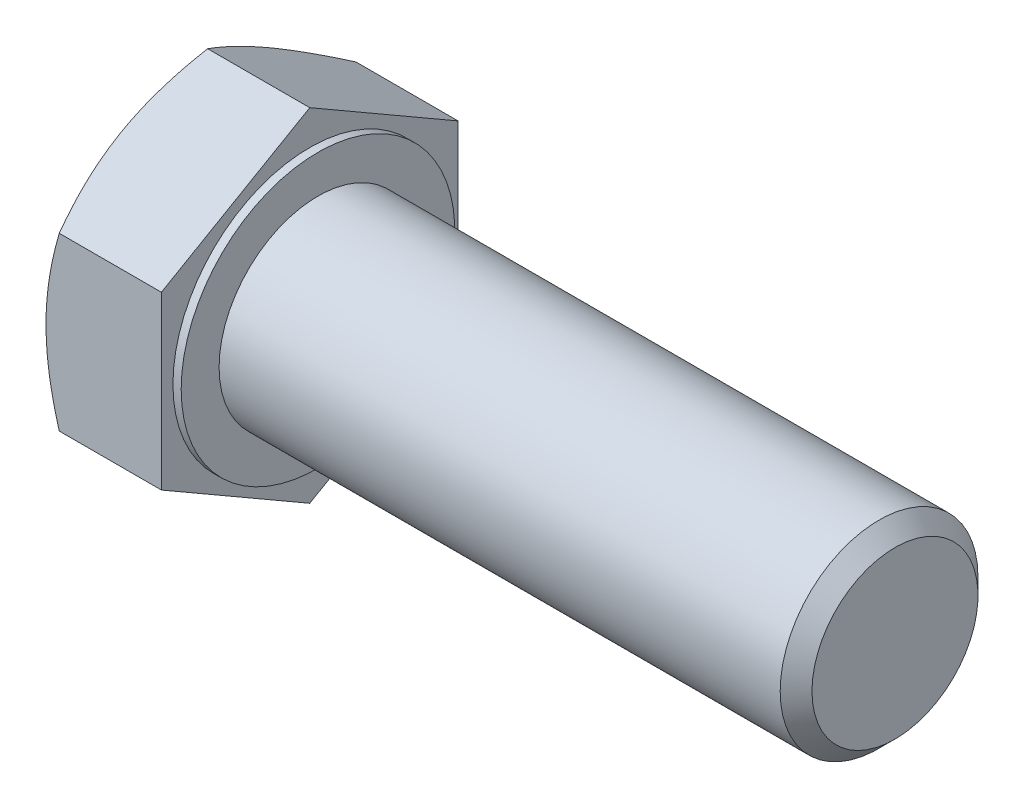
ISO-10303-21;
HEADER;
FILE_DESCRIPTION(('STEP AP214'),'2;1');
FILE_NAME('part.step','',(''),(''),'','','');
FILE_SCHEMA(('AUTOMOTIVE_DESIGN { 1 0 10303 214 1 1 1 1 }'));
ENDSEC;
DATA;
#1=APPLICATION_CONTEXT('core data for automotive mechanical design processes');
#2=APPLICATION_PROTOCOL_DEFINITION('international standard','automotive_design',2000,#1);
#3=PRODUCT_CONTEXT('',#1,'mechanical');
#4=PRODUCT('Part','Part','',(#3));
#5=PRODUCT_RELATED_PRODUCT_CATEGORY('part','',(#4));
#6=PRODUCT_DEFINITION_FORMATION('','',#4);
#7=PRODUCT_DEFINITION_CONTEXT('part definition',#1,'design');
#8=PRODUCT_DEFINITION('design','',#6,#7);
#9=PRODUCT_DEFINITION_SHAPE('','',#8);
#10=(LENGTH_UNIT() NAMED_UNIT(*) SI_UNIT(.MILLI.,.METRE.));
#11=(NAMED_UNIT(*) PLANE_ANGLE_UNIT() SI_UNIT($,.RADIAN.));
#12=(NAMED_UNIT(*) SI_UNIT($,.STERADIAN.) SOLID_ANGLE_UNIT());
#13=UNCERTAINTY_MEASURE_WITH_UNIT(LENGTH_MEASURE(1.E-05),#10,'distance_accuracy_value','');
#14=(GEOMETRIC_REPRESENTATION_CONTEXT(3) GLOBAL_UNCERTAINTY_ASSIGNED_CONTEXT((#13)) GLOBAL_UNIT_ASSIGNED_CONTEXT((#10,
#11,#12)) REPRESENTATION_CONTEXT('',''));
#15=CARTESIAN_POINT('',(0.,0.,0.));
#16=DIRECTION('',(0.,0.,1.));
#17=DIRECTION('',(1.,0.,0.));
#18=AXIS2_PLACEMENT_3D('',#15,#16,#17);
#19=CARTESIAN_POINT('',(7.5,10.3923048454133,0.));
#20=DIRECTION('',(1.,0.,0.));
#21=DIRECTION('',(0.,0.,-1.));
#22=AXIS2_PLACEMENT_3D('',#19,#20,#21);
#23=PLANE('',#22);
#24=CARTESIAN_POINT('',(7.5,0.,0.));
#25=DIRECTION('',(1.,0.,0.));
#26=DIRECTION('',(0.,0.,-1.));
#27=AXIS2_PLACEMENT_3D('',#24,#25,#26);
#28=CIRCLE('',#27,6.);
#29=CARTESIAN_POINT('',(7.5,0.,-6.));
#30=VERTEX_POINT('',#29);
#31=EDGE_CURVE('E150',#30,#30,#28,.F.);
#32=ORIENTED_EDGE('',*,*,#31,.T.);
#33=EDGE_LOOP('',(#32));
#34=FACE_BOUND('',#33,.T.);
#35=CARTESIAN_POINT('',(7.5,0.,0.));
#36=DIRECTION('',(-1.,0.,0.));
#37=DIRECTION('',(0.,0.,1.));
#38=AXIS2_PLACEMENT_3D('',#35,#36,#37);
#39=CIRCLE('',#38,8.3);
#40=CARTESIAN_POINT('',(7.5,0.,8.3));
#41=VERTEX_POINT('',#40);
#42=EDGE_CURVE('E341',#41,#41,#39,.T.);
#43=ORIENTED_EDGE('',*,*,#42,.F.);
#44=EDGE_LOOP('',(#43));
#45=FACE_BOUND('',#44,.T.);
#46=ADVANCED_FACE('F55',(#34,#45),#23,.T.);
#47=CARTESIAN_POINT('',(0.,0.,0.));
#48=DIRECTION('',(-1.,0.,0.));
#49=DIRECTION('',(0.,0.,1.));
#50=AXIS2_PLACEMENT_3D('',#47,#48,#49);
#51=CYLINDRICAL_SURFACE('',#50,6.);
#52=ORIENTED_EDGE('',*,*,#31,.F.);
#53=EDGE_LOOP('',(#52));
#54=FACE_BOUND('',#53,.T.);
#55=CARTESIAN_POINT('',(41.536,0.,0.));
#56=DIRECTION('',(-1.,0.,0.));
#57=DIRECTION('',(0.,0.,1.));
#58=AXIS2_PLACEMENT_3D('',#55,#56,#57);
#59=CIRCLE('',#58,6.);
#60=CARTESIAN_POINT('',(41.536,0.,6.));
#61=VERTEX_POINT('',#60);
#62=EDGE_CURVE('E159',#61,#61,#59,.T.);
#63=ORIENTED_EDGE('',*,*,#62,.T.);
#64=EDGE_LOOP('',(#63));
#65=FACE_BOUND('',#64,.T.);
#66=ADVANCED_FACE('F313',(#54,#65),#51,.T.);
#67=CARTESIAN_POINT('',(42.5,0.,0.));
#68=DIRECTION('',(-1.,0.,0.));
#69=DIRECTION('',(0.,0.,1.));
#70=AXIS2_PLACEMENT_3D('',#67,#68,#69);
#71=CONICAL_SURFACE('',#70,5.036,0.785398163397442);
#72=ORIENTED_EDGE('',*,*,#62,.F.);
#73=EDGE_LOOP('',(#72));
#74=FACE_BOUND('',#73,.T.);
#75=CARTESIAN_POINT('',(42.5,0.,0.));
#76=DIRECTION('',(-1.,0.,0.));
#77=DIRECTION('',(0.,0.,1.));
#78=AXIS2_PLACEMENT_3D('',#75,#76,#77);
#79=CIRCLE('',#78,5.036);
#80=CARTESIAN_POINT('',(42.5,0.,5.036));
#81=VERTEX_POINT('',#80);
#82=EDGE_CURVE('E304',#81,#81,#79,.T.);
#83=ORIENTED_EDGE('',*,*,#82,.T.);
#84=EDGE_LOOP('',(#83));
#85=FACE_BOUND('',#84,.T.);
#86=ADVANCED_FACE('F315',(#74,#85),#71,.T.);
#87=CARTESIAN_POINT('',(42.5,0.,0.));
#88=DIRECTION('',(-1.,0.,0.));
#89=DIRECTION('',(0.,0.,1.));
#90=AXIS2_PLACEMENT_3D('',#87,#88,#89);
#91=PLANE('',#90);
#92=ORIENTED_EDGE('',*,*,#82,.F.);
#93=EDGE_LOOP('',(#92));
#94=FACE_BOUND('',#93,.T.);
#95=ADVANCED_FACE('F318',(#94),#91,.F.);
#96=CARTESIAN_POINT('',(7.,8.3,0.));
#97=DIRECTION('',(1.,0.,0.));
#98=DIRECTION('',(0.,0.,-1.));
#99=AXIS2_PLACEMENT_3D('',#96,#97,#98);
#100=PLANE('',#99);
#101=CARTESIAN_POINT('',(7.,0.,0.));
#102=DIRECTION('',(-1.,0.,0.));
#103=DIRECTION('',(0.,0.,1.));
#104=AXIS2_PLACEMENT_3D('',#101,#102,#103);
#105=CIRCLE('',#104,8.3);
#106=CARTESIAN_POINT('',(7.,0.,8.3));
#107=VERTEX_POINT('',#106);
#108=EDGE_CURVE('E344',#107,#107,#105,.T.);
#109=ORIENTED_EDGE('',*,*,#108,.T.);
#110=EDGE_LOOP('',(#109));
#111=FACE_BOUND('',#110,.T.);
#112=DIRECTION('',(0.,0.500000000000001,0.866025403784438));
#113=VECTOR('',#112,1.);
#114=CARTESIAN_POINT('',(7.,5.19615242270662,-9.));
#115=LINE('',#114,#113);
#116=CARTESIAN_POINT('',(7.,5.19615242270662,-9.));
#117=VERTEX_POINT('',#116);
#118=CARTESIAN_POINT('',(7.,10.3923048454133,0.));
#119=VERTEX_POINT('',#118);
#120=EDGE_CURVE('E128',#117,#119,#115,.T.);
#121=ORIENTED_EDGE('',*,*,#120,.T.);
#122=DIRECTION('',(0.,-0.500000000000001,0.866025403784438));
#123=VECTOR('',#122,1.);
#124=CARTESIAN_POINT('',(7.,10.3923048454133,0.));
#125=LINE('',#124,#123);
#126=CARTESIAN_POINT('',(7.,5.19615242270662,9.));
#127=VERTEX_POINT('',#126);
#128=EDGE_CURVE('E141',#119,#127,#125,.T.);
#129=ORIENTED_EDGE('',*,*,#128,.T.);
#130=DIRECTION('',(0.,-1.,0.));
#131=VECTOR('',#130,1.);
#132=CARTESIAN_POINT('',(7.,5.19615242270662,9.));
#133=LINE('',#132,#131);
#134=CARTESIAN_POINT('',(7.,-5.19615242270661,9.));
#135=VERTEX_POINT('',#134);
#136=EDGE_CURVE('E357',#127,#135,#133,.T.);
#137=ORIENTED_EDGE('',*,*,#136,.T.);
#138=DIRECTION('',(0.,-0.500000000000002,-0.866025403784438));
#139=VECTOR('',#138,1.);
#140=CARTESIAN_POINT('',(7.,-10.3923048454133,0.));
#141=LINE('',#140,#139);
#142=CARTESIAN_POINT('',(7.,-10.3923048454133,0.));
#143=VERTEX_POINT('',#142);
#144=EDGE_CURVE('E354',#135,#143,#141,.T.);
#145=ORIENTED_EDGE('',*,*,#144,.T.);
#146=DIRECTION('',(0.,0.5,-0.866025403784439));
#147=VECTOR('',#146,1.);
#148=CARTESIAN_POINT('',(7.,-5.19615242270664,-9.));
#149=LINE('',#148,#147);
#150=CARTESIAN_POINT('',(7.,-5.19615242270664,-9.));
#151=VERTEX_POINT('',#150);
#152=EDGE_CURVE('E71',#143,#151,#149,.T.);
#153=ORIENTED_EDGE('',*,*,#152,.T.);
#154=DIRECTION('',(0.,1.,0.));
#155=VECTOR('',#154,1.);
#156=CARTESIAN_POINT('',(7.,5.19615242270662,-9.));
#157=LINE('',#156,#155);
#158=EDGE_CURVE('E11',#151,#117,#157,.T.);
#159=ORIENTED_EDGE('',*,*,#158,.T.);
#160=EDGE_LOOP('',(#121,#129,#137,#145,#153,#159));
#161=FACE_BOUND('',#160,.T.);
#162=ADVANCED_FACE('F127',(#111,#161),#100,.T.);
#163=CARTESIAN_POINT('',(0.,0.,0.));
#164=DIRECTION('',(-1.,0.,0.));
#165=DIRECTION('',(0.,0.,1.));
#166=AXIS2_PLACEMENT_3D('',#163,#164,#165);
#167=CYLINDRICAL_SURFACE('',#166,8.3);
#168=ORIENTED_EDGE('',*,*,#42,.T.);
#169=EDGE_LOOP('',(#168));
#170=FACE_BOUND('',#169,.T.);
#171=ORIENTED_EDGE('',*,*,#108,.F.);
#172=EDGE_LOOP('',(#171));
#173=FACE_BOUND('',#172,.T.);
#174=ADVANCED_FACE('F327',(#170,#173),#167,.T.);
#175=CARTESIAN_POINT('',(0.,10.3923048454133,0.));
#176=DIRECTION('',(1.,0.,0.));
#177=DIRECTION('',(0.,0.,-1.));
#178=AXIS2_PLACEMENT_3D('',#175,#176,#177);
#179=PLANE('',#178);
#180=CARTESIAN_POINT('',(0.,0.,0.));
#181=DIRECTION('',(1.,0.,0.));
#182=DIRECTION('',(0.,0.,-1.));
#183=AXIS2_PLACEMENT_3D('',#180,#181,#182);
#184=CIRCLE('',#183,9.);
#185=CARTESIAN_POINT('',(0.,0.,-9.));
#186=VERTEX_POINT('',#185);
#187=CARTESIAN_POINT('',(0.,7.79422863405994,-4.50000000000001));
#188=VERTEX_POINT('',#187);
#189=EDGE_CURVE('E65',#186,#188,#184,.T.);
#190=ORIENTED_EDGE('',*,*,#189,.F.);
#191=CARTESIAN_POINT('',(0.,-7.79422863405995,-4.5));
#192=VERTEX_POINT('',#191);
#193=EDGE_CURVE('E172',#192,#186,#184,.T.);
#194=ORIENTED_EDGE('',*,*,#193,.F.);
#195=CARTESIAN_POINT('',(0.,-7.79422863405994,4.50000000000002));
#196=VERTEX_POINT('',#195);
#197=EDGE_CURVE('E175',#196,#192,#184,.T.);
#198=ORIENTED_EDGE('',*,*,#197,.F.);
#199=CARTESIAN_POINT('',(0.,0.,9.));
#200=VERTEX_POINT('',#199);
#201=EDGE_CURVE('E183',#200,#196,#184,.T.);
#202=ORIENTED_EDGE('',*,*,#201,.F.);
#203=CARTESIAN_POINT('',(0.,0.,0.));
#204=DIRECTION('',(-1.,0.,0.));
#205=DIRECTION('',(0.,0.,1.));
#206=AXIS2_PLACEMENT_3D('',#203,#204,#205);
#207=CIRCLE('',#206,9.);
#208=CARTESIAN_POINT('',(0.,7.79422863405994,4.50000000000001));
#209=VERTEX_POINT('',#208);
#210=EDGE_CURVE('E140',#200,#209,#207,.T.);
#211=ORIENTED_EDGE('',*,*,#210,.T.);
#212=EDGE_CURVE('E185',#188,#209,#184,.T.);
#213=ORIENTED_EDGE('',*,*,#212,.F.);
#214=EDGE_LOOP('',(#190,#194,#198,#202,#211,#213));
#215=FACE_BOUND('',#214,.T.);
#216=ADVANCED_FACE('F210',(#215),#179,.F.);
#217=CARTESIAN_POINT('',(0.,0.,0.));
#218=DIRECTION('',(1.,0.,0.));
#219=DIRECTION('',(0.,0.,-1.));
#220=AXIS2_PLACEMENT_3D('',#217,#218,#219);
#221=CONICAL_SURFACE('',#220,9.,1.0471975511966);
#222=CARTESIAN_POINT('',(0.803914245071126,5.19603695265279,9.0002));
#223=CARTESIAN_POINT('',(0.737982001874049,5.31024090414013,8.80239295359879));
#224=CARTESIAN_POINT('',(0.675041409210307,5.42489028935502,8.60381439335006));
#225=CARTESIAN_POINT('',(0.555968997655531,5.65512011728599,8.20504463395579));
#226=CARTESIAN_POINT('',(0.499840117752057,5.77070093910681,8.00485277818155));
#227=CARTESIAN_POINT('',(0.395151960728957,6.00300811711761,7.6024849429039));
#228=CARTESIAN_POINT('',(0.346610772912781,6.11973652630803,7.4003054074994));
#229=CARTESIAN_POINT('',(0.258148516787916,6.35398725476076,6.99457124410926));
#230=CARTESIAN_POINT('',(0.21822568748327,6.47150940676615,6.79101690582109));
#231=CARTESIAN_POINT('',(0.148684674147111,6.70436794207327,6.38769409169309));
#232=CARTESIAN_POINT('',(0.118837502847797,6.81968712510142,6.187955407601));
#233=CARTESIAN_POINT('',(0.0687933098590788,7.05084147798785,5.78758432401101));
#234=CARTESIAN_POINT('',(0.0485954355375368,7.16667660134328,5.5869520050584));
#235=CARTESIAN_POINT('',(0.0183543473973442,7.39854776775318,5.18533936402619));
#236=CARTESIAN_POINT('',(0.00829960958430043,7.51458343241836,4.98435969733607));
#237=CARTESIAN_POINT('',(-0.00143766485492008,7.74676155069016,4.58221540008358));
#238=CARTESIAN_POINT('',(-0.00112052193524597,7.86290400088661,4.38105077542778));
#239=CARTESIAN_POINT('',(0.00916395215317157,8.08003584616207,4.0049673874695));
#240=CARTESIAN_POINT('',(0.0178767400303957,8.18104055171996,3.83002210563971));
#241=CARTESIAN_POINT('',(0.042977340065369,8.38281337570172,3.48054132291666));
#242=CARTESIAN_POINT('',(0.0593656695806686,8.4835814777175,3.30600585044303));
#243=CARTESIAN_POINT('',(0.119656556235829,8.7854956741391,2.7830751227145));
#244=CARTESIAN_POINT('',(0.174677482341129,8.98610736306936,2.43560548489509));
#245=CARTESIAN_POINT('',(0.312230476325152,9.38945876049729,1.736980371246));
#246=CARTESIAN_POINT('',(0.395345618627108,9.59214699192737,1.38591405631283));
#247=CARTESIAN_POINT('',(0.583982539436463,9.99450087051226,0.689016695981395));
#248=CARTESIAN_POINT('',(0.689460012893358,10.1941716700214,0.343176726443721));
#249=CARTESIAN_POINT('',(0.803914245071132,10.3924203154671,-0.000199999999999286));
#250=B_SPLINE_CURVE_WITH_KNOTS('',3,(#222,#223,#224,#225,#226,#227,#228,#229,#230,#231,#232,
#233,#234,#235,#236,#237,#238,#239,#240,#241,#242,#243,#244,#245,#246,#247,#248,#249),
.UNSPECIFIED.,.F.,.F.,(4,2,2,2,2,2,2,2,2,2,2,2,2,4),(0.,0.713219249102575,1.42674513853509,
2.14194697262263,2.8570025303448,3.55449749123034,4.25193080859215,4.94857085059645,
5.64518936892662,6.25162976378284,6.85811104066341,8.07193747617894,9.31268391793542,
10.5509947443908),.UNSPECIFIED.);
#251=CARTESIAN_POINT('',(0.803847577293367,10.3923048454133,0.));
#252=VERTEX_POINT('',#251);
#253=EDGE_CURVE('E231',#209,#252,#250,.T.);
#254=ORIENTED_EDGE('',*,*,#253,.T.);
#255=CARTESIAN_POINT('',(0.803914245071133,10.3924203154671,0.0002));
#256=CARTESIAN_POINT('',(0.737982001874055,10.2782163639798,-0.197607046401216));
#257=CARTESIAN_POINT('',(0.675041409210313,10.1635669787649,-0.396185606649945));
#258=CARTESIAN_POINT('',(0.555968997655536,9.93333715083391,-0.794955366044209));
#259=CARTESIAN_POINT('',(0.499840117752062,9.81775632901308,-0.99514722181845));
#260=CARTESIAN_POINT('',(0.395151960728962,9.58544915100228,-1.3975150570961));
#261=CARTESIAN_POINT('',(0.346610772912787,9.46872074181186,-1.5996945925006));
#262=CARTESIAN_POINT('',(0.258148516787921,9.23447001335913,-2.00542875589074));
#263=CARTESIAN_POINT('',(0.218225687483273,9.11694786135374,-2.20898309417891));
#264=CARTESIAN_POINT('',(0.148684674147113,8.88408932604662,-2.61230590830691));
#265=CARTESIAN_POINT('',(0.118837502847799,8.76877014301847,-2.812044592399));
#266=CARTESIAN_POINT('',(0.0687933098590814,8.53761579013205,-3.21241567598899));
#267=CARTESIAN_POINT('',(0.0485954355375386,8.42178066677662,-3.4130479949416));
#268=CARTESIAN_POINT('',(0.0183543473973454,8.18990950036671,-3.81466063597382));
#269=CARTESIAN_POINT('',(0.00829960958430177,8.07387383570153,-4.01564030266393));
#270=CARTESIAN_POINT('',(-0.00143766485491891,7.84169571742973,-4.41778459991642));
#271=CARTESIAN_POINT('',(-0.00112052193524512,7.72555326723328,-4.61894922457222));
#272=CARTESIAN_POINT('',(0.00916395215317128,7.50842142195782,-4.9950326125305));
#273=CARTESIAN_POINT('',(0.0178767400303946,7.40741671639993,-5.16997789436029));
#274=CARTESIAN_POINT('',(0.0429773400653671,7.20564389241818,-5.51945867708335));
#275=CARTESIAN_POINT('',(0.0593656695806669,7.10487579040239,-5.69399414955697));
#276=CARTESIAN_POINT('',(0.119656556235828,6.80296159398079,-6.2169248772855));
#277=CARTESIAN_POINT('',(0.174677482341126,6.60234990505054,-6.56439451510491));
#278=CARTESIAN_POINT('',(0.312230476325148,6.1989985076226,-7.263019628754));
#279=CARTESIAN_POINT('',(0.395345618627104,5.99631027619252,-7.61408594368717));
#280=CARTESIAN_POINT('',(0.583982539436458,5.59395639760763,-8.3109833040186));
#281=CARTESIAN_POINT('',(0.689460012893353,5.39428559809852,-8.65682327355628));
#282=CARTESIAN_POINT('',(0.803914245071127,5.19603695265279,-9.0002));
#283=B_SPLINE_CURVE_WITH_KNOTS('',3,(#255,#256,#257,#258,#259,#260,#261,#262,#263,#264,#265,
#266,#267,#268,#269,#270,#271,#272,#273,#274,#275,#276,#277,#278,#279,#280,#281,#282),
.UNSPECIFIED.,.F.,.F.,(4,2,2,2,2,2,2,2,2,2,2,2,2,4),(0.,0.713219249102579,1.42674513853509,
2.14194697262263,2.8570025303448,3.55449749123034,4.25193080859215,4.94857085059645,
5.64518936892663,6.25162976378284,6.85811104066341,8.07193747617895,9.31268391793542,
10.5509947443908),.UNSPECIFIED.);
#284=EDGE_CURVE('E79',#252,#188,#283,.T.);
#285=ORIENTED_EDGE('',*,*,#284,.T.);
#286=ORIENTED_EDGE('',*,*,#212,.T.);
#287=EDGE_LOOP('',(#254,#285,#286));
#288=FACE_BOUND('',#287,.T.);
#289=ADVANCED_FACE('F407',(#288),#221,.T.);
#290=CARTESIAN_POINT('',(4.50308345116275,-14.1853984650015,9.));
#291=CARTESIAN_POINT('',(4.31054430443782,-13.7903499522351,9.));
#292=CARTESIAN_POINT('',(4.11978647586971,-13.3944187196266,9.));
#293=CARTESIAN_POINT('',(3.74283090620236,-12.6003222266754,9.));
#294=CARTESIAN_POINT('',(3.55663384146592,-12.2021566456113,9.));
#295=CARTESIAN_POINT('',(3.18890856344588,-11.4011783965729,9.));
#296=CARTESIAN_POINT('',(3.00740939067649,-10.9983523517115,9.));
#297=CARTESIAN_POINT('',(2.65153988681447,-10.1895752665153,9.));
#298=CARTESIAN_POINT('',(2.47716923358452,-9.78362436837962,9.));
#299=CARTESIAN_POINT('',(2.1316124492693,-8.953981891894,9.));
#300=CARTESIAN_POINT('',(1.96074001408348,-8.53015895315932,9.));
#301=CARTESIAN_POINT('',(1.63138410023259,-7.6776404040306,9.));
#302=CARTESIAN_POINT('',(1.47290197976961,-7.24894426532903,9.));
#303=CARTESIAN_POINT('',(1.17232155137939,-6.38672363138014,9.));
#304=CARTESIAN_POINT('',(1.0301919447447,-5.95321016213059,9.));
#305=CARTESIAN_POINT('',(0.766724668389701,-5.07998336095625,9.));
#306=CARTESIAN_POINT('',(0.645380685452063,-4.64027195560254,9.));
#307=CARTESIAN_POINT('',(0.429822600041207,-3.75682505769697,9.));
#308=CARTESIAN_POINT('',(0.335452586446509,-3.31312863828557,9.));
#309=CARTESIAN_POINT('',(0.218090109997791,-2.6433671330566,9.));
#310=CARTESIAN_POINT('',(0.1829998621584,-2.41939560703653,9.));
#311=CARTESIAN_POINT('',(0.121565667357827,-1.9702635438669,9.));
#312=CARTESIAN_POINT('',(0.0952208701204425,-1.74510312447118,9.));
#313=CARTESIAN_POINT('',(0.0521451472278595,-1.29693480879161,9.));
#314=CARTESIAN_POINT('',(0.0352889798642664,-1.07393900194961,9.));
#315=CARTESIAN_POINT('',(0.0110310639342778,-0.627433600763141,9.));
#316=CARTESIAN_POINT('',(0.00362915208926377,-0.40392401535862,9.));
#317=CARTESIAN_POINT('',(-0.00154262379217504,0.0432079361744999,9.));
#318=CARTESIAN_POINT('',(0.000687480645623833,0.266830301931571,9.));
#319=CARTESIAN_POINT('',(0.01472260772345,0.713776872824072,9.));
#320=CARTESIAN_POINT('',(0.0265280659473003,0.93710106393258,9.));
#321=CARTESIAN_POINT('',(0.0656502898571858,1.46707211896635,9.));
#322=CARTESIAN_POINT('',(0.0971347677291201,1.77341845056802,9.));
#323=CARTESIAN_POINT('',(0.176454333238005,2.38397028008967,9.));
#324=CARTESIAN_POINT('',(0.224291457717823,2.6881755064995,9.));
#325=CARTESIAN_POINT('',(0.389806402965327,3.59715813116676,9.));
#326=CARTESIAN_POINT('',(0.529461896846416,4.19799412652232,9.));
#327=CARTESIAN_POINT('',(0.773331871848972,5.09670706348811,9.));
#328=CARTESIAN_POINT('',(0.861532431142633,5.39919910543196,9.));
#329=CARTESIAN_POINT('',(1.04752099203163,6.00125026101996,9.));
#330=CARTESIAN_POINT('',(1.14530906206943,6.30080935370985,9.));
#331=CARTESIAN_POINT('',(1.34886866039496,6.89708058771342,9.));
#332=CARTESIAN_POINT('',(1.45463787690012,7.19379352557788,9.));
#333=CARTESIAN_POINT('',(1.6728730196874,7.78473287386445,9.));
#334=CARTESIAN_POINT('',(1.78533883473293,8.07895932549671,9.));
#335=CARTESIAN_POINT('',(2.07523735271454,8.8161944490185,9.));
#336=CARTESIAN_POINT('',(2.25629467011385,9.25777584408896,9.));
#337=CARTESIAN_POINT('',(2.62827522263087,10.1367776511578,9.));
#338=CARTESIAN_POINT('',(2.81919928705198,10.5741977097237,9.));
#339=CARTESIAN_POINT('',(3.20877963371492,11.4457286497122,9.));
#340=CARTESIAN_POINT('',(3.40743823107647,11.8798384930871,9.));
#341=CARTESIAN_POINT('',(3.81079737205718,12.7452179469075,9.));
#342=CARTESIAN_POINT('',(4.01549773502308,13.1764876418049,9.));
#343=CARTESIAN_POINT('',(4.43000777500988,14.0372827141758,9.));
#344=CARTESIAN_POINT('',(4.63982402220295,14.466804921625,9.));
#345=CARTESIAN_POINT('',(5.06336871339291,15.3239162694583,9.));
#346=CARTESIAN_POINT('',(5.27709718099328,15.7515053981603,9.));
#347=CARTESIAN_POINT('',(5.70771289609102,16.6049951424422,9.));
#348=CARTESIAN_POINT('',(5.92459958876705,17.0308960382694,9.));
#349=CARTESIAN_POINT('',(6.36101693257489,17.8813418239716,9.));
#350=CARTESIAN_POINT('',(6.58054759472945,18.305886708184,9.));
#351=CARTESIAN_POINT('',(7.20096689356042,19.4981240117253,9.));
#352=CARTESIAN_POINT('',(7.60436223424865,20.2645118375987,9.));
#353=CARTESIAN_POINT('',(8.41646747703505,21.7945065925678,9.));
#354=CARTESIAN_POINT('',(8.82517763220601,22.558113387008,9.));
#355=CARTESIAN_POINT('',(9.6453899211846,24.08088542414,9.));
#356=CARTESIAN_POINT('',(10.0568800806834,24.8400571209878,9.));
#357=CARTESIAN_POINT('',(10.6764233675492,25.9775231898088,9.));
#358=CARTESIAN_POINT('',(10.8833155902988,26.3564507889065,9.));
#359=CARTESIAN_POINT('',(11.2977907102886,27.1139273756374,9.));
#360=CARTESIAN_POINT('',(11.5053736065156,27.4924763638249,9.));
#361=CARTESIAN_POINT('',(11.7132605802833,27.8708583347744,9.));
#362=B_SPLINE_CURVE_WITH_KNOTS('',3,(#290,#291,#292,#293,#294,#295,#296,#297,#298,#299,#300,
#301,#302,#303,#304,#305,#306,#307,#308,#309,#310,#311,#312,#313,#314,#315,#316,#317,#318,#319,
#320,#321,#322,#323,#324,#325,#326,#327,#328,#329,#330,#331,#332,#333,#334,#335,#336,#337,#338,
#339,#340,#341,#342,#343,#344,#345,#346,#347,#348,#349,#350,#351,#352,#353,#354,#355,#356,#357,
#358,#359,#360,#361),.UNSPECIFIED.,.F.,.F.,(4,2,2,2,2,2,2,2,2,2,2,2,2,2,2,2,2,2,2,2,2,2,2,2,2,2,
2,2,2,2,2,2,2,2,2,4),(0.,1.31842765114837,2.6370496560634,3.96247407620814,5.28783853415268,
6.65860358746619,8.02951869129602,9.39776460603692,10.7655942037287,12.1253499441535,
12.8053173169584,13.4852185605779,14.1559216013657,14.8266130586982,15.4973023208461,
16.1680220944284,17.0913849082023,18.0148627755644,19.862742604473,20.8079230410616,
21.75311022551,22.6980246745778,23.6429234321322,25.0745302305723,26.5062575523684,
27.9384167676661,29.3705332036396,30.8045973553514,32.2386701620091,33.6724940065179,
35.1063238307243,37.7045032490066,40.3028068397952,42.8933552129342,44.1885437295509,
45.4837303472313),.UNSPECIFIED.);
#363=CARTESIAN_POINT('',(0.803847577293361,5.19615242270662,9.));
#364=VERTEX_POINT('',#363);
#365=EDGE_CURVE('E222',#200,#364,#362,.T.);
#366=ORIENTED_EDGE('',*,*,#365,.T.);
#367=EDGE_CURVE('E223',#364,#209,#250,.T.);
#368=ORIENTED_EDGE('',*,*,#367,.T.);
#369=ORIENTED_EDGE('',*,*,#210,.F.);
#370=EDGE_LOOP('',(#366,#368,#369));
#371=FACE_BOUND('',#370,.T.);
#372=ADVANCED_FACE('F369',(#371),#221,.T.);
#373=CARTESIAN_POINT('',(0.803847577293355,-5.19615242270661,9.));
#374=VERTEX_POINT('',#373);
#375=EDGE_CURVE('E206',#374,#200,#362,.T.);
#376=ORIENTED_EDGE('',*,*,#375,.T.);
#377=ORIENTED_EDGE('',*,*,#201,.T.);
#378=CARTESIAN_POINT('',(0.803914245071129,-10.3924203154671,-0.000200000000000038));
#379=CARTESIAN_POINT('',(0.73798200187405,-10.2782163639798,0.197607046401216));
#380=CARTESIAN_POINT('',(0.675041409210308,-10.1635669787649,0.396185606649944));
#381=CARTESIAN_POINT('',(0.555968997655532,-9.9333371508339,0.794955366044208));
#382=CARTESIAN_POINT('',(0.499840117752058,-9.81775632901307,0.995147221818449));
#383=CARTESIAN_POINT('',(0.395151960728958,-9.58544915100227,1.3975150570961));
#384=CARTESIAN_POINT('',(0.346610772912781,-9.46872074181185,1.59969459250059));
#385=CARTESIAN_POINT('',(0.258148516787915,-9.23447001335912,2.00542875589074));
#386=CARTESIAN_POINT('',(0.218225687483268,-9.11694786135373,2.20898309417891));
#387=CARTESIAN_POINT('',(0.148684674147108,-8.88408932604661,2.61230590830691));
#388=CARTESIAN_POINT('',(0.118837502847793,-8.76877014301846,2.812044592399));
#389=CARTESIAN_POINT('',(0.0687933098590751,-8.53761579013204,3.21241567598899));
#390=CARTESIAN_POINT('',(0.0485954355375334,-8.42178066677661,3.4130479949416));
#391=CARTESIAN_POINT('',(0.0183543473973407,-8.1899095003667,3.81466063597381));
#392=CARTESIAN_POINT('',(0.00829960958429661,-8.07387383570152,4.01564030266393));
#393=CARTESIAN_POINT('',(-0.00143766485492478,-7.84169571742972,4.41778459991642));
#394=CARTESIAN_POINT('',(-0.00112052193525114,-7.72555326723327,4.61894922457221));
#395=CARTESIAN_POINT('',(0.00916395215316483,-7.50842142195781,4.99503261253049));
#396=CARTESIAN_POINT('',(0.017876740030388,-7.40741671639992,5.16997789436028));
#397=CARTESIAN_POINT('',(0.0429773400653602,-7.20564389241816,5.51945867708334));
#398=CARTESIAN_POINT('',(0.0593656695806599,-7.10487579040238,5.69399414955696));
#399=CARTESIAN_POINT('',(0.11965655623582,-6.80296159398078,6.2169248772855));
#400=CARTESIAN_POINT('',(0.174677482341119,-6.60234990505052,6.56439451510491));
#401=CARTESIAN_POINT('',(0.312230476325142,-6.19899850762259,7.263019628754));
#402=CARTESIAN_POINT('',(0.395345618627098,-5.99631027619251,7.61408594368717));
#403=CARTESIAN_POINT('',(0.583982539436453,-5.59395639760761,8.3109833040186));
#404=CARTESIAN_POINT('',(0.689460012893348,-5.3942855980985,8.65682327355628));
#405=CARTESIAN_POINT('',(0.803914245071121,-5.19603695265277,9.0002));
#406=B_SPLINE_CURVE_WITH_KNOTS('',3,(#378,#379,#380,#381,#382,#383,#384,#385,#386,#387,#388,
#389,#390,#391,#392,#393,#394,#395,#396,#397,#398,#399,#400,#401,#402,#403,#404,#405),
.UNSPECIFIED.,.F.,.F.,(4,2,2,2,2,2,2,2,2,2,2,2,2,4),(0.,0.713219249102579,1.42674513853509,
2.14194697262263,2.8570025303448,3.55449749123034,4.25193080859215,4.94857085059645,
5.64518936892663,6.25162976378284,6.85811104066341,8.07193747617895,9.31268391793542,
10.5509947443908),.UNSPECIFIED.);
#407=EDGE_CURVE('E204',#196,#374,#406,.T.);
#408=ORIENTED_EDGE('',*,*,#407,.T.);
#409=EDGE_LOOP('',(#376,#377,#408));
#410=FACE_BOUND('',#409,.T.);
#411=ADVANCED_FACE('F202',(#410),#221,.T.);
#412=CARTESIAN_POINT('',(0.803847577293364,-10.3923048454133,0.));
#413=VERTEX_POINT('',#412);
#414=EDGE_CURVE('E219',#413,#196,#406,.T.);
#415=ORIENTED_EDGE('',*,*,#414,.T.);
#416=ORIENTED_EDGE('',*,*,#197,.T.);
#417=CARTESIAN_POINT('',(0.803914245071132,-5.1960369526528,-9.0002));
#418=CARTESIAN_POINT('',(0.737982001874053,-5.31024090414015,-8.80239295359879));
#419=CARTESIAN_POINT('',(0.675041409210311,-5.42489028935504,-8.60381439335006));
#420=CARTESIAN_POINT('',(0.555968997655536,-5.655120117286,-8.20504463395579));
#421=CARTESIAN_POINT('',(0.499840117752062,-5.77070093910683,-8.00485277818155));
#422=CARTESIAN_POINT('',(0.395151960728962,-6.00300811711762,-7.6024849429039));
#423=CARTESIAN_POINT('',(0.346610772912786,-6.11973652630805,-7.4003054074994));
#424=CARTESIAN_POINT('',(0.25814851678792,-6.35398725476078,-6.99457124410925));
#425=CARTESIAN_POINT('',(0.218225687483273,-6.47150940676616,-6.79101690582109));
#426=CARTESIAN_POINT('',(0.148684674147114,-6.70436794207328,-6.38769409169308));
#427=CARTESIAN_POINT('',(0.1188375028478,-6.81968712510143,-6.187955407601));
#428=CARTESIAN_POINT('',(0.0687933098590818,-7.05084147798786,-5.787584324011));
#429=CARTESIAN_POINT('',(0.0485954355375398,-7.16667660134328,-5.58695200505839));
#430=CARTESIAN_POINT('',(0.0183543473973475,-7.39854776775319,-5.18533936402618));
#431=CARTESIAN_POINT('',(0.00829960958430413,-7.51458343241837,-4.98435969733606));
#432=CARTESIAN_POINT('',(-0.00143766485491676,-7.74676155069017,-4.58221540008357));
#433=CARTESIAN_POINT('',(-0.00112052193524346,-7.86290400088662,-4.38105077542778));
#434=CARTESIAN_POINT('',(0.00916395215317359,-8.08003584616208,-4.0049673874695));
#435=CARTESIAN_POINT('',(0.0178767400303979,-8.18104055171996,-3.83002210563971));
#436=CARTESIAN_POINT('',(0.0429773400653708,-8.38281337570172,-3.48054132291665));
#437=CARTESIAN_POINT('',(0.0593656695806701,-8.48358147771751,-3.30600585044303));
#438=CARTESIAN_POINT('',(0.11965655623583,-8.7854956741391,-2.7830751227145));
#439=CARTESIAN_POINT('',(0.174677482341129,-8.98610736306936,-2.43560548489509));
#440=CARTESIAN_POINT('',(0.312230476325151,-9.38945876049729,-1.736980371246));
#441=CARTESIAN_POINT('',(0.395345618627106,-9.59214699192737,-1.38591405631283));
#442=CARTESIAN_POINT('',(0.583982539436459,-9.99450087051226,-0.689016695981396));
#443=CARTESIAN_POINT('',(0.689460012893354,-10.1941716700214,-0.343176726443723));
#444=CARTESIAN_POINT('',(0.803914245071129,-10.3924203154671,0.000199999999998914));
#445=B_SPLINE_CURVE_WITH_KNOTS('',3,(#417,#418,#419,#420,#421,#422,#423,#424,#425,#426,#427,
#428,#429,#430,#431,#432,#433,#434,#435,#436,#437,#438,#439,#440,#441,#442,#443,#444),
.UNSPECIFIED.,.F.,.F.,(4,2,2,2,2,2,2,2,2,2,2,2,2,4),(0.,0.713219249102577,1.42674513853509,
2.14194697262263,2.85700253034481,3.55449749123034,4.25193080859215,4.94857085059645,
5.64518936892663,6.25162976378284,6.85811104066341,8.07193747617894,9.31268391793541,
10.5509947443908),.UNSPECIFIED.);
#446=EDGE_CURVE('E241',#192,#413,#445,.T.);
#447=ORIENTED_EDGE('',*,*,#446,.T.);
#448=EDGE_LOOP('',(#415,#416,#447));
#449=FACE_BOUND('',#448,.T.);
#450=ADVANCED_FACE('F402',(#449),#221,.T.);
#451=CARTESIAN_POINT('',(0.803847577293361,5.19615242270662,-9.));
#452=VERTEX_POINT('',#451);
#453=EDGE_CURVE('E251',#188,#452,#283,.T.);
#454=ORIENTED_EDGE('',*,*,#453,.T.);
#455=CARTESIAN_POINT('',(4.50308345606077,-14.1853984750485,-9.));
#456=CARTESIAN_POINT('',(4.31054430913195,-13.7903499619441,-9.));
#457=CARTESIAN_POINT('',(4.11978648036006,-13.3944187289972,-9.));
#458=CARTESIAN_POINT('',(3.74283091028612,-12.6003222353684,-9.));
#459=CARTESIAN_POINT('',(3.55663384534688,-12.2021566539649,-9.));
#460=CARTESIAN_POINT('',(3.18890856692113,-11.4011784042428,-9.));
#461=CARTESIAN_POINT('',(3.00740939394888,-10.998352359037,-9.));
#462=CARTESIAN_POINT('',(2.65153988968445,-10.1895752731496,-9.));
#463=CARTESIAN_POINT('',(2.47716923625495,-9.78362437466717,-9.));
#464=CARTESIAN_POINT('',(2.13161245153418,-8.9539818974599,-9.));
#465=CARTESIAN_POINT('',(1.96074001614284,-8.53015895835007,-9.));
#466=CARTESIAN_POINT('',(1.63138410189175,-7.67764040846509,-9.));
#467=CARTESIAN_POINT('',(1.4729019812341,-7.2489442693824,-9.));
#468=CARTESIAN_POINT('',(1.17232155247293,-6.38672363466423,-9.));
#469=CARTESIAN_POINT('',(1.03019194566191,-5.95321016502653,-9.));
#470=CARTESIAN_POINT('',(0.766724668982649,-5.07998336306546,-9.));
#471=CARTESIAN_POINT('',(0.645380685897061,-4.64027195731317,-9.));
#472=CARTESIAN_POINT('',(0.429822600187398,-3.75682505840834,-9.));
#473=CARTESIAN_POINT('',(0.335452586452975,-3.31312863839348,-9.));
#474=CARTESIAN_POINT('',(0.218090109862415,-2.64336713224848,-9.));
#475=CARTESIAN_POINT('',(0.182999861987047,-2.41939560592137,-9.));
#476=CARTESIAN_POINT('',(0.121565667139731,-1.97026354213498,-9.));
#477=CARTESIAN_POINT('',(0.0952208698915747,-1.74510312242953,-9.));
#478=CARTESIAN_POINT('',(0.0521451470049075,-1.29693480613701,-9.));
#479=CARTESIAN_POINT('',(0.0352889796574908,-1.07393899899182,-9.));
#480=CARTESIAN_POINT('',(0.0110310637867468,-0.627433597199462,-9.));
#481=CARTESIAN_POINT('',(0.00362915198480072,-0.403924011492234,-9.));
#482=CARTESIAN_POINT('',(-0.00154262378413871,0.0432079406441109,-9.));
#483=CARTESIAN_POINT('',(0.000687480723095741,0.266830306701701,-9.));
#484=CARTESIAN_POINT('',(0.0147226079643596,0.713776878191381,-9.));
#485=CARTESIAN_POINT('',(0.0265280662822145,0.937101069596548,-9.));
#486=CARTESIAN_POINT('',(0.065650290423212,1.46707212508443,-9.));
#487=CARTESIAN_POINT('',(0.0971347684278853,1.77341845684228,-9.));
#488=CARTESIAN_POINT('',(0.176454334209292,2.38397028666909,-9.));
#489=CARTESIAN_POINT('',(0.224291458828895,2.6881755132279,-9.));
#490=CARTESIAN_POINT('',(0.389806404498592,3.59715813833381,-9.));
#491=CARTESIAN_POINT('',(0.52946189866475,4.19799413397005,-9.));
#492=CARTESIAN_POINT('',(0.773331874087602,5.09670707135544,-9.));
#493=CARTESIAN_POINT('',(0.861532433522246,5.39919911344213,-9.));
#494=CARTESIAN_POINT('',(1.04752099468879,6.00125026931416,-9.));
#495=CARTESIAN_POINT('',(1.14530906486314,6.30080936214524,-9.));
#496=CARTESIAN_POINT('',(1.34886866345677,6.8970805964301,-9.));
#497=CARTESIAN_POINT('',(1.45463788009346,7.19379353443467,-9.));
#498=CARTESIAN_POINT('',(1.67287302313913,7.78473288300147,-9.));
#499=CARTESIAN_POINT('',(1.78533883831151,8.07895933477385,-9.));
#500=CARTESIAN_POINT('',(2.07523735650254,8.81619445838355,-9.));
#501=CARTESIAN_POINT('',(2.25629467397395,9.25777585340506,-9.));
#502=CARTESIAN_POINT('',(2.62827522661661,10.1367776603819,-9.));
#503=CARTESIAN_POINT('',(2.81919929109125,10.5741977189049,-9.));
#504=CARTESIAN_POINT('',(3.20877963784732,11.4457286588119,-9.));
#505=CARTESIAN_POINT('',(3.40743823524846,11.8798385021483,-9.));
#506=CARTESIAN_POINT('',(3.81079737629817,12.7452179558959,-9.));
#507=CARTESIAN_POINT('',(4.01549773929348,13.1764876507589,-9.));
#508=CARTESIAN_POINT('',(4.43000777933055,14.0372827230624,-9.));
#509=CARTESIAN_POINT('',(4.63982402654445,14.4668049304786,-9.));
#510=CARTESIAN_POINT('',(5.06336871777018,15.3239162782486,-9.));
#511=CARTESIAN_POINT('',(5.27709718538548,15.7515054069201,-9.));
#512=CARTESIAN_POINT('',(5.70771290050867,16.6049951511436,-9.));
#513=CARTESIAN_POINT('',(5.92459959319523,17.0308960469429,-9.));
#514=CARTESIAN_POINT('',(6.36101693702058,17.8813418325907,-9.));
#515=CARTESIAN_POINT('',(6.58054759918212,18.3058867167768,-9.));
#516=CARTESIAN_POINT('',(7.20096689804886,19.4981240202845,-9.));
#517=CARTESIAN_POINT('',(7.60436223876306,20.264511846152,-9.));
#518=CARTESIAN_POINT('',(8.41646748159571,21.794506601112,-9.));
#519=CARTESIAN_POINT('',(8.82517763678694,22.5581133955489,-9.));
#520=CARTESIAN_POINT('',(9.64538992580601,24.0808854326838,-9.));
#521=CARTESIAN_POINT('',(10.0568800853251,24.8400571295377,-9.));
#522=CARTESIAN_POINT('',(10.6764233722193,25.977523198369,-9.));
#523=CARTESIAN_POINT('',(10.883315594978,26.3564507974704,-9.));
#524=CARTESIAN_POINT('',(11.2977907149855,27.1139273842089,-9.));
#525=CARTESIAN_POINT('',(11.5053736112211,27.4924763724004,-9.));
#526=CARTESIAN_POINT('',(11.7132605849971,27.870858343354,-9.));
#527=B_SPLINE_CURVE_WITH_KNOTS('',3,(#455,#456,#457,#458,#459,#460,#461,#462,#463,#464,#465,
#466,#467,#468,#469,#470,#471,#472,#473,#474,#475,#476,#477,#478,#479,#480,#481,#482,#483,#484,
#485,#486,#487,#488,#489,#490,#491,#492,#493,#494,#495,#496,#497,#498,#499,#500,#501,#502,#503,
#504,#505,#506,#507,#508,#509,#510,#511,#512,#513,#514,#515,#516,#517,#518,#519,#520,#521,#522,
#523,#524,#525,#526),.UNSPECIFIED.,.F.,.F.,(4,2,2,2,2,2,2,2,2,2,2,2,2,2,2,2,2,2,2,2,2,2,2,2,2,2,
2,2,2,2,2,2,2,2,2,4),(0.,1.3184276523281,2.63704965842302,3.96247407975987,5.28783853889642,
6.65860359348417,8.02951869858868,9.39776461460018,10.7655942135616,12.1253499558398,
12.8053173295708,13.4852185741162,14.1559216158065,14.8266130740414,15.4973023370921,
16.1680221115773,17.0913849258576,18.0148627937263,19.8627426236502,20.8079230607688,
21.7531102457472,22.6980246953435,23.6429234534266,25.0745302518135,26.5062575735559,
27.9384167887983,29.3705332247166,30.804597376367,32.2386701829632,33.6724940274115,
35.1063238515574,37.7045032698604,40.3028068606692,42.8933552338532,44.1885437504927,
45.4837303681959),.UNSPECIFIED.);
#528=EDGE_CURVE('E147',#452,#186,#527,.F.);
#529=ORIENTED_EDGE('',*,*,#528,.T.);
#530=ORIENTED_EDGE('',*,*,#189,.T.);
#531=EDGE_LOOP('',(#454,#529,#530));
#532=FACE_BOUND('',#531,.T.);
#533=ADVANCED_FACE('F400',(#532),#221,.T.);
#534=CARTESIAN_POINT('',(0.803847577293111,-5.19615242270702,-9.));
#535=VERTEX_POINT('',#534);
#536=EDGE_CURVE('E247',#535,#192,#445,.T.);
#537=ORIENTED_EDGE('',*,*,#536,.T.);
#538=ORIENTED_EDGE('',*,*,#193,.T.);
#539=EDGE_CURVE('E264',#186,#535,#527,.F.);
#540=ORIENTED_EDGE('',*,*,#539,.T.);
#541=EDGE_LOOP('',(#537,#538,#540));
#542=FACE_BOUND('',#541,.T.);
#543=ADVANCED_FACE('F281',(#542),#221,.T.);
#544=CARTESIAN_POINT('',(7.5,5.19615242270662,-9.));
#545=DIRECTION('',(0.,0.,1.));
#546=DIRECTION('',(0.,-1.,0.));
#547=AXIS2_PLACEMENT_3D('',#544,#545,#546);
#548=PLANE('',#547);
#549=ORIENTED_EDGE('',*,*,#158,.F.);
#550=DIRECTION('',(-1.,0.,0.));
#551=VECTOR('',#550,1.);
#552=CARTESIAN_POINT('',(7.5,-5.19615242270664,-9.));
#553=LINE('',#552,#551);
#554=EDGE_CURVE('E149',#151,#535,#553,.T.);
#555=ORIENTED_EDGE('',*,*,#554,.T.);
#556=ORIENTED_EDGE('',*,*,#539,.F.);
#557=ORIENTED_EDGE('',*,*,#528,.F.);
#558=DIRECTION('',(-1.,0.,0.));
#559=VECTOR('',#558,1.);
#560=CARTESIAN_POINT('',(7.5,5.19615242270662,-9.));
#561=LINE('',#560,#559);
#562=EDGE_CURVE('E136',#117,#452,#561,.T.);
#563=ORIENTED_EDGE('',*,*,#562,.F.);
#564=EDGE_LOOP('',(#549,#555,#556,#557,#563));
#565=FACE_BOUND('',#564,.T.);
#566=ADVANCED_FACE('F144',(#565),#548,.F.);
#567=CARTESIAN_POINT('',(7.5,-5.19615242270664,-9.));
#568=DIRECTION('',(0.,0.866025403784439,0.5));
#569=DIRECTION('',(0.,-0.5,0.866025403784439));
#570=AXIS2_PLACEMENT_3D('',#567,#568,#569);
#571=PLANE('',#570);
#572=ORIENTED_EDGE('',*,*,#152,.F.);
#573=DIRECTION('',(-1.,0.,0.));
#574=VECTOR('',#573,1.);
#575=CARTESIAN_POINT('',(7.5,-10.3923048454133,0.));
#576=LINE('',#575,#574);
#577=EDGE_CURVE('E156',#143,#413,#576,.T.);
#578=ORIENTED_EDGE('',*,*,#577,.T.);
#579=ORIENTED_EDGE('',*,*,#446,.F.);
#580=ORIENTED_EDGE('',*,*,#536,.F.);
#581=ORIENTED_EDGE('',*,*,#554,.F.);
#582=EDGE_LOOP('',(#572,#578,#579,#580,#581));
#583=FACE_BOUND('',#582,.T.);
#584=ADVANCED_FACE('F280',(#583),#571,.F.);
#585=CARTESIAN_POINT('',(7.5,-10.3923048454133,0.));
#586=DIRECTION('',(0.,0.866025403784437,-0.500000000000002));
#587=DIRECTION('',(0.,0.500000000000002,0.866025403784438));
#588=AXIS2_PLACEMENT_3D('',#585,#586,#587);
#589=PLANE('',#588);
#590=ORIENTED_EDGE('',*,*,#144,.F.);
#591=DIRECTION('',(-1.,0.,0.));
#592=VECTOR('',#591,1.);
#593=CARTESIAN_POINT('',(7.5,-5.19615242270661,9.));
#594=LINE('',#593,#592);
#595=EDGE_CURVE('E165',#135,#374,#594,.T.);
#596=ORIENTED_EDGE('',*,*,#595,.T.);
#597=ORIENTED_EDGE('',*,*,#407,.F.);
#598=ORIENTED_EDGE('',*,*,#414,.F.);
#599=ORIENTED_EDGE('',*,*,#577,.F.);
#600=EDGE_LOOP('',(#590,#596,#597,#598,#599));
#601=FACE_BOUND('',#600,.T.);
#602=ADVANCED_FACE('F217',(#601),#589,.F.);
#603=CARTESIAN_POINT('',(7.5,5.19615242270662,9.));
#604=DIRECTION('',(0.,0.,-1.));
#605=DIRECTION('',(0.,1.,0.));
#606=AXIS2_PLACEMENT_3D('',#603,#604,#605);
#607=PLANE('',#606);
#608=ORIENTED_EDGE('',*,*,#136,.F.);
#609=DIRECTION('',(-1.,0.,0.));
#610=VECTOR('',#609,1.);
#611=CARTESIAN_POINT('',(7.5,5.19615242270662,9.));
#612=LINE('',#611,#610);
#613=EDGE_CURVE('E168',#127,#364,#612,.T.);
#614=ORIENTED_EDGE('',*,*,#613,.T.);
#615=ORIENTED_EDGE('',*,*,#365,.F.);
#616=ORIENTED_EDGE('',*,*,#375,.F.);
#617=ORIENTED_EDGE('',*,*,#595,.F.);
#618=EDGE_LOOP('',(#608,#614,#615,#616,#617));
#619=FACE_BOUND('',#618,.T.);
#620=ADVANCED_FACE('F289',(#619),#607,.F.);
#621=CARTESIAN_POINT('',(7.5,10.3923048454133,0.));
#622=DIRECTION('',(0.,-0.866025403784438,-0.500000000000001));
#623=DIRECTION('',(0.,0.500000000000001,-0.866025403784438));
#624=AXIS2_PLACEMENT_3D('',#621,#622,#623);
#625=PLANE('',#624);
#626=ORIENTED_EDGE('',*,*,#128,.F.);
#627=DIRECTION('',(-1.,0.,0.));
#628=VECTOR('',#627,1.);
#629=CARTESIAN_POINT('',(7.5,10.3923048454133,0.));
#630=LINE('',#629,#628);
#631=EDGE_CURVE('E138',#119,#252,#630,.T.);
#632=ORIENTED_EDGE('',*,*,#631,.T.);
#633=ORIENTED_EDGE('',*,*,#253,.F.);
#634=ORIENTED_EDGE('',*,*,#367,.F.);
#635=ORIENTED_EDGE('',*,*,#613,.F.);
#636=EDGE_LOOP('',(#626,#632,#633,#634,#635));
#637=FACE_BOUND('',#636,.T.);
#638=ADVANCED_FACE('F292',(#637),#625,.F.);
#639=CARTESIAN_POINT('',(7.5,5.19615242270662,-9.));
#640=DIRECTION('',(0.,-0.866025403784438,0.500000000000001));
#641=DIRECTION('',(0.,-0.500000000000001,-0.866025403784438));
#642=AXIS2_PLACEMENT_3D('',#639,#640,#641);
#643=PLANE('',#642);
#644=ORIENTED_EDGE('',*,*,#120,.F.);
#645=ORIENTED_EDGE('',*,*,#562,.T.);
#646=ORIENTED_EDGE('',*,*,#453,.F.);
#647=ORIENTED_EDGE('',*,*,#284,.F.);
#648=ORIENTED_EDGE('',*,*,#631,.F.);
#649=EDGE_LOOP('',(#644,#645,#646,#647,#648));
#650=FACE_BOUND('',#649,.T.);
#651=ADVANCED_FACE('F57',(#650),#643,.F.);
#652=CLOSED_SHELL('',(#46,#66,#86,#95,#162,#174,#216,#289,#372,#411,#450,#533,#543,#566,#584,
#602,#620,#638,#651));
#653=MANIFOLD_SOLID_BREP('B2',#652);
#654=ADVANCED_BREP_SHAPE_REPRESENTATION('',(#18,#653),#14);
#655=SHAPE_DEFINITION_REPRESENTATION(#9,#654);
ENDSEC;
END-ISO-10303-21;
